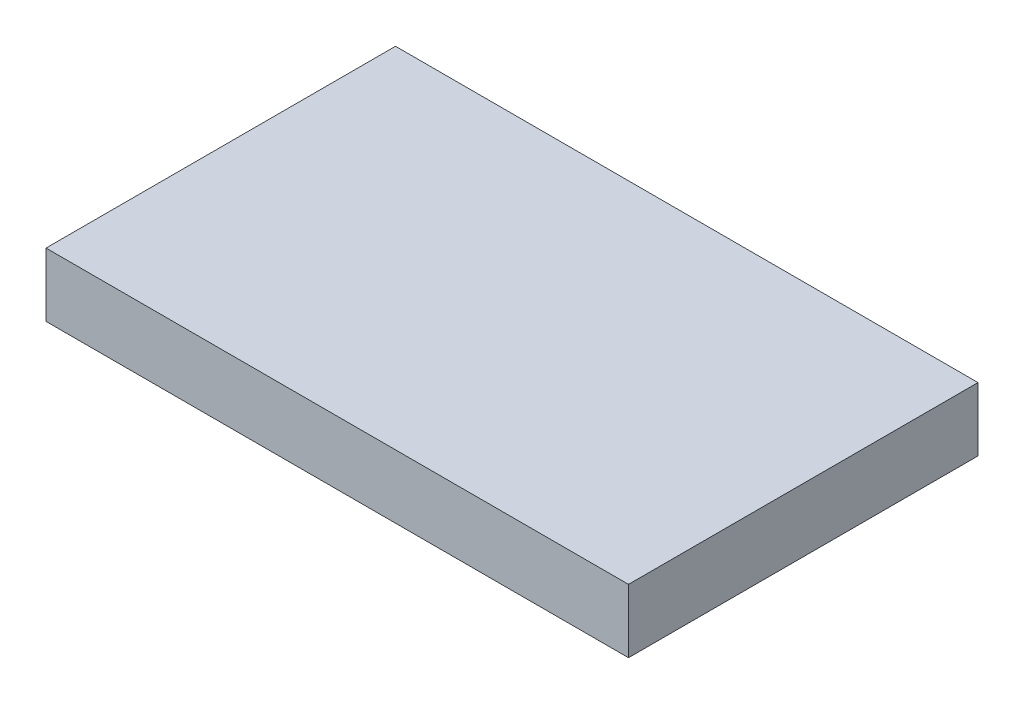
ISO-10303-21;
HEADER;
FILE_DESCRIPTION(('STEP AP214'),'2;1');
FILE_NAME('part.step','',(''),(''),'','','');
FILE_SCHEMA(('AUTOMOTIVE_DESIGN { 1 0 10303 214 1 1 1 1 }'));
ENDSEC;
DATA;
#1=APPLICATION_CONTEXT('core data for automotive mechanical design processes');
#2=APPLICATION_PROTOCOL_DEFINITION('international standard','automotive_design',2000,#1);
#3=PRODUCT_CONTEXT('',#1,'mechanical');
#4=PRODUCT('Part','Part','',(#3));
#5=PRODUCT_RELATED_PRODUCT_CATEGORY('part','',(#4));
#6=PRODUCT_DEFINITION_FORMATION('','',#4);
#7=PRODUCT_DEFINITION_CONTEXT('part definition',#1,'design');
#8=PRODUCT_DEFINITION('design','',#6,#7);
#9=PRODUCT_DEFINITION_SHAPE('','',#8);
#10=(LENGTH_UNIT() NAMED_UNIT(*) SI_UNIT(.MILLI.,.METRE.));
#11=(NAMED_UNIT(*) PLANE_ANGLE_UNIT() SI_UNIT($,.RADIAN.));
#12=(NAMED_UNIT(*) SI_UNIT($,.STERADIAN.) SOLID_ANGLE_UNIT());
#13=UNCERTAINTY_MEASURE_WITH_UNIT(LENGTH_MEASURE(1.E-05),#10,'distance_accuracy_value','');
#14=(GEOMETRIC_REPRESENTATION_CONTEXT(3) GLOBAL_UNCERTAINTY_ASSIGNED_CONTEXT((#13)) GLOBAL_UNIT_ASSIGNED_CONTEXT((#10,
#11,#12)) REPRESENTATION_CONTEXT('',''));
#15=CARTESIAN_POINT('',(0.,0.,0.));
#16=DIRECTION('',(0.,0.,1.));
#17=DIRECTION('',(1.,0.,0.));
#18=AXIS2_PLACEMENT_3D('',#15,#16,#17);
#19=CARTESIAN_POINT('',(13.75,3.,8.25));
#20=DIRECTION('',(-1.,0.,0.));
#21=DIRECTION('',(0.,0.,1.));
#22=AXIS2_PLACEMENT_3D('',#19,#20,#21);
#23=PLANE('',#22);
#24=DIRECTION('',(0.,0.,-1.));
#25=VECTOR('',#24,1.);
#26=CARTESIAN_POINT('',(13.75,0.,8.25));
#27=LINE('',#26,#25);
#28=CARTESIAN_POINT('',(13.75,0.,8.25));
#29=VERTEX_POINT('',#28);
#30=CARTESIAN_POINT('',(13.75,0.,-8.25));
#31=VERTEX_POINT('',#30);
#32=EDGE_CURVE('E113',#29,#31,#27,.T.);
#33=ORIENTED_EDGE('',*,*,#32,.T.);
#34=DIRECTION('',(0.,-1.,0.));
#35=VECTOR('',#34,1.);
#36=CARTESIAN_POINT('',(13.75,3.,-8.25));
#37=LINE('',#36,#35);
#38=CARTESIAN_POINT('',(13.75,3.,-8.25));
#39=VERTEX_POINT('',#38);
#40=EDGE_CURVE('E11',#39,#31,#37,.T.);
#41=ORIENTED_EDGE('',*,*,#40,.F.);
#42=DIRECTION('',(0.,0.,-1.));
#43=VECTOR('',#42,1.);
#44=CARTESIAN_POINT('',(13.75,3.,8.25));
#45=LINE('',#44,#43);
#46=CARTESIAN_POINT('',(13.75,3.,8.25));
#47=VERTEX_POINT('',#46);
#48=EDGE_CURVE('E97',#47,#39,#45,.T.);
#49=ORIENTED_EDGE('',*,*,#48,.F.);
#50=DIRECTION('',(0.,-1.,0.));
#51=VECTOR('',#50,1.);
#52=CARTESIAN_POINT('',(13.75,3.,8.25));
#53=LINE('',#52,#51);
#54=EDGE_CURVE('E109',#47,#29,#53,.T.);
#55=ORIENTED_EDGE('',*,*,#54,.T.);
#56=EDGE_LOOP('',(#33,#41,#49,#55));
#57=FACE_BOUND('',#56,.T.);
#58=ADVANCED_FACE('F45',(#57),#23,.F.);
#59=CARTESIAN_POINT('',(-13.75,3.,-8.25));
#60=DIRECTION('',(0.,0.,1.));
#61=DIRECTION('',(1.,0.,0.));
#62=AXIS2_PLACEMENT_3D('',#59,#60,#61);
#63=PLANE('',#62);
#64=DIRECTION('',(-1.,0.,0.));
#65=VECTOR('',#64,1.);
#66=CARTESIAN_POINT('',(-13.75,0.,-8.25));
#67=LINE('',#66,#65);
#68=CARTESIAN_POINT('',(-13.75,0.,-8.25));
#69=VERTEX_POINT('',#68);
#70=EDGE_CURVE('E102',#31,#69,#67,.T.);
#71=ORIENTED_EDGE('',*,*,#70,.T.);
#72=DIRECTION('',(0.,-1.,0.));
#73=VECTOR('',#72,1.);
#74=CARTESIAN_POINT('',(-13.75,3.,-8.25));
#75=LINE('',#74,#73);
#76=CARTESIAN_POINT('',(-13.75,3.,-8.25));
#77=VERTEX_POINT('',#76);
#78=EDGE_CURVE('E54',#77,#69,#75,.T.);
#79=ORIENTED_EDGE('',*,*,#78,.F.);
#80=DIRECTION('',(-1.,0.,0.));
#81=VECTOR('',#80,1.);
#82=CARTESIAN_POINT('',(-13.75,3.,-8.25));
#83=LINE('',#82,#81);
#84=EDGE_CURVE('E92',#39,#77,#83,.T.);
#85=ORIENTED_EDGE('',*,*,#84,.F.);
#86=ORIENTED_EDGE('',*,*,#40,.T.);
#87=EDGE_LOOP('',(#71,#79,#85,#86));
#88=FACE_BOUND('',#87,.T.);
#89=ADVANCED_FACE('F101',(#88),#63,.F.);
#90=CARTESIAN_POINT('',(-13.75,3.,8.25));
#91=DIRECTION('',(1.,0.,0.));
#92=DIRECTION('',(0.,0.,-1.));
#93=AXIS2_PLACEMENT_3D('',#90,#91,#92);
#94=PLANE('',#93);
#95=DIRECTION('',(0.,0.,1.));
#96=VECTOR('',#95,1.);
#97=CARTESIAN_POINT('',(-13.75,0.,8.25));
#98=LINE('',#97,#96);
#99=CARTESIAN_POINT('',(-13.75,0.,8.25));
#100=VERTEX_POINT('',#99);
#101=EDGE_CURVE('E79',#69,#100,#98,.T.);
#102=ORIENTED_EDGE('',*,*,#101,.T.);
#103=DIRECTION('',(0.,-1.,0.));
#104=VECTOR('',#103,1.);
#105=CARTESIAN_POINT('',(-13.75,3.,8.25));
#106=LINE('',#105,#104);
#107=CARTESIAN_POINT('',(-13.75,3.,8.25));
#108=VERTEX_POINT('',#107);
#109=EDGE_CURVE('E104',#108,#100,#106,.T.);
#110=ORIENTED_EDGE('',*,*,#109,.F.);
#111=DIRECTION('',(0.,0.,1.));
#112=VECTOR('',#111,1.);
#113=CARTESIAN_POINT('',(-13.75,3.,8.25));
#114=LINE('',#113,#112);
#115=EDGE_CURVE('E95',#77,#108,#114,.T.);
#116=ORIENTED_EDGE('',*,*,#115,.F.);
#117=ORIENTED_EDGE('',*,*,#78,.T.);
#118=EDGE_LOOP('',(#102,#110,#116,#117));
#119=FACE_BOUND('',#118,.T.);
#120=ADVANCED_FACE('F105',(#119),#94,.F.);
#121=CARTESIAN_POINT('',(-13.75,3.,8.25));
#122=DIRECTION('',(0.,0.,-1.));
#123=DIRECTION('',(-1.,0.,0.));
#124=AXIS2_PLACEMENT_3D('',#121,#122,#123);
#125=PLANE('',#124);
#126=DIRECTION('',(1.,0.,0.));
#127=VECTOR('',#126,1.);
#128=CARTESIAN_POINT('',(-13.75,0.,8.25));
#129=LINE('',#128,#127);
#130=EDGE_CURVE('E85',#100,#29,#129,.T.);
#131=ORIENTED_EDGE('',*,*,#130,.T.);
#132=ORIENTED_EDGE('',*,*,#54,.F.);
#133=DIRECTION('',(1.,0.,0.));
#134=VECTOR('',#133,1.);
#135=CARTESIAN_POINT('',(-13.75,3.,8.25));
#136=LINE('',#135,#134);
#137=EDGE_CURVE('E62',#108,#47,#136,.T.);
#138=ORIENTED_EDGE('',*,*,#137,.F.);
#139=ORIENTED_EDGE('',*,*,#109,.T.);
#140=EDGE_LOOP('',(#131,#132,#138,#139));
#141=FACE_BOUND('',#140,.T.);
#142=ADVANCED_FACE('F126',(#141),#125,.F.);
#143=CARTESIAN_POINT('',(0.,3.,0.));
#144=DIRECTION('',(0.,-1.,0.));
#145=DIRECTION('',(0.,0.,-1.));
#146=AXIS2_PLACEMENT_3D('',#143,#144,#145);
#147=PLANE('',#146);
#148=ORIENTED_EDGE('',*,*,#48,.T.);
#149=ORIENTED_EDGE('',*,*,#84,.T.);
#150=ORIENTED_EDGE('',*,*,#115,.T.);
#151=ORIENTED_EDGE('',*,*,#137,.T.);
#152=EDGE_LOOP('',(#148,#149,#150,#151));
#153=FACE_BOUND('',#152,.T.);
#154=ADVANCED_FACE('F93',(#153),#147,.F.);
#155=CARTESIAN_POINT('',(0.,0.,0.));
#156=DIRECTION('',(0.,-1.,0.));
#157=DIRECTION('',(0.,0.,-1.));
#158=AXIS2_PLACEMENT_3D('',#155,#156,#157);
#159=PLANE('',#158);
#160=ORIENTED_EDGE('',*,*,#32,.F.);
#161=ORIENTED_EDGE('',*,*,#130,.F.);
#162=ORIENTED_EDGE('',*,*,#101,.F.);
#163=ORIENTED_EDGE('',*,*,#70,.F.);
#164=EDGE_LOOP('',(#160,#161,#162,#163));
#165=FACE_BOUND('',#164,.T.);
#166=ADVANCED_FACE('F129',(#165),#159,.T.);
#167=CLOSED_SHELL('',(#58,#89,#120,#142,#154,#166));
#168=MANIFOLD_SOLID_BREP('B2',#167);
#169=ADVANCED_BREP_SHAPE_REPRESENTATION('',(#18,#168),#14);
#170=SHAPE_DEFINITION_REPRESENTATION(#9,#169);
ENDSEC;
END-ISO-10303-21;
